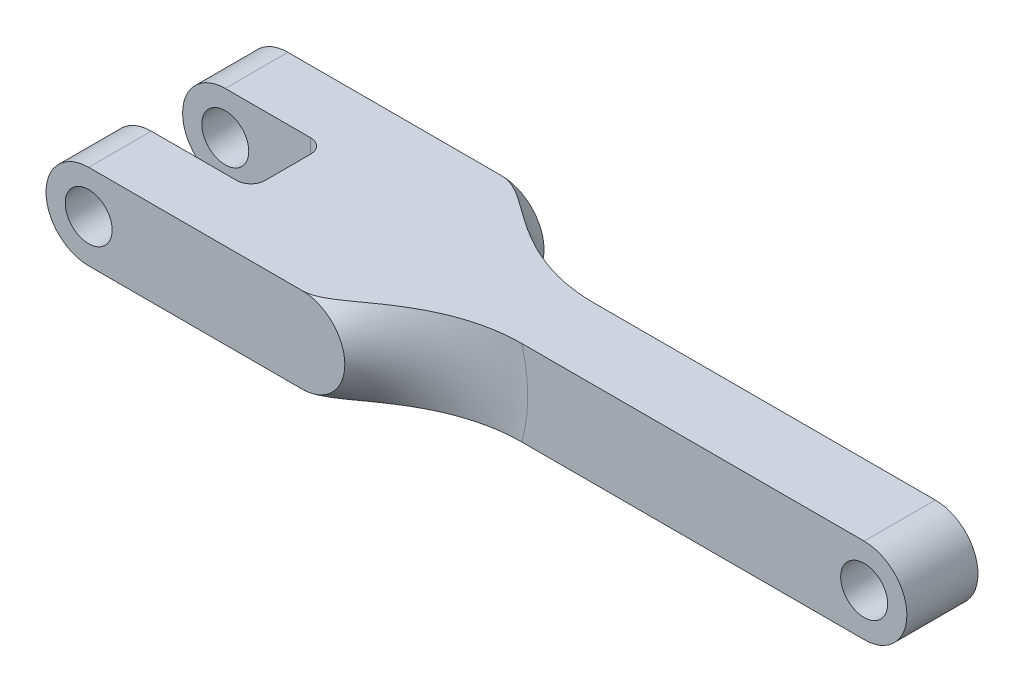
ISO-10303-21;
HEADER;
FILE_DESCRIPTION(('STEP AP214'),'2;1');
FILE_NAME('part.step','',(''),(''),'','','');
FILE_SCHEMA(('AUTOMOTIVE_DESIGN { 1 0 10303 214 1 1 1 1 }'));
ENDSEC;
DATA;
#1=APPLICATION_CONTEXT('core data for automotive mechanical design processes');
#2=APPLICATION_PROTOCOL_DEFINITION('international standard','automotive_design',2000,#1);
#3=PRODUCT_CONTEXT('',#1,'mechanical');
#4=PRODUCT('Part','Part','',(#3));
#5=PRODUCT_RELATED_PRODUCT_CATEGORY('part','',(#4));
#6=PRODUCT_DEFINITION_FORMATION('','',#4);
#7=PRODUCT_DEFINITION_CONTEXT('part definition',#1,'design');
#8=PRODUCT_DEFINITION('design','',#6,#7);
#9=PRODUCT_DEFINITION_SHAPE('','',#8);
#10=(LENGTH_UNIT() NAMED_UNIT(*) SI_UNIT(.MILLI.,.METRE.));
#11=(NAMED_UNIT(*) PLANE_ANGLE_UNIT() SI_UNIT($,.RADIAN.));
#12=(NAMED_UNIT(*) SI_UNIT($,.STERADIAN.) SOLID_ANGLE_UNIT());
#13=UNCERTAINTY_MEASURE_WITH_UNIT(LENGTH_MEASURE(1.E-05),#10,'distance_accuracy_value','');
#14=(GEOMETRIC_REPRESENTATION_CONTEXT(3) GLOBAL_UNCERTAINTY_ASSIGNED_CONTEXT((#13)) GLOBAL_UNIT_ASSIGNED_CONTEXT((#10,
#11,#12)) REPRESENTATION_CONTEXT('',''));
#15=CARTESIAN_POINT('',(0.,0.,0.));
#16=DIRECTION('',(0.,0.,1.));
#17=DIRECTION('',(1.,0.,0.));
#18=AXIS2_PLACEMENT_3D('',#15,#16,#17);
#19=CARTESIAN_POINT('',(-25.,0.,-2.5));
#20=DIRECTION('',(0.,0.,1.));
#21=DIRECTION('',(1.,0.,0.));
#22=AXIS2_PLACEMENT_3D('',#19,#20,#21);
#23=CYLINDRICAL_SURFACE('',#22,3.00000000000001);
#24=CARTESIAN_POINT('',(-25.,0.,2.6));
#25=DIRECTION('',(0.,0.,1.));
#26=DIRECTION('',(1.,0.,0.));
#27=AXIS2_PLACEMENT_3D('',#24,#25,#26);
#28=CIRCLE('',#27,3.00000000000001);
#29=CARTESIAN_POINT('',(-25.,-3.00000000000001,2.6));
#30=VERTEX_POINT('',#29);
#31=CARTESIAN_POINT('',(-25.,3.00000000000001,2.6));
#32=VERTEX_POINT('',#31);
#33=EDGE_CURVE('E501',#30,#32,#28,.F.);
#34=ORIENTED_EDGE('',*,*,#33,.F.);
#35=DIRECTION('',(0.,0.,1.));
#36=VECTOR('',#35,1.);
#37=CARTESIAN_POINT('',(-25.,-3.00000000000001,-2.5));
#38=LINE('',#37,#36);
#39=CARTESIAN_POINT('',(-25.,-3.00000000000001,7.));
#40=VERTEX_POINT('',#39);
#41=EDGE_CURVE('E181',#30,#40,#38,.T.);
#42=ORIENTED_EDGE('',*,*,#41,.T.);
#43=CARTESIAN_POINT('',(-25.,0.,7.));
#44=DIRECTION('',(0.,0.,1.));
#45=DIRECTION('',(1.,0.,0.));
#46=AXIS2_PLACEMENT_3D('',#43,#44,#45);
#47=CIRCLE('',#46,3.00000000000001);
#48=CARTESIAN_POINT('',(-25.,3.00000000000001,7.));
#49=VERTEX_POINT('',#48);
#50=EDGE_CURVE('E485',#49,#40,#47,.T.);
#51=ORIENTED_EDGE('',*,*,#50,.F.);
#52=DIRECTION('',(0.,0.,1.));
#53=VECTOR('',#52,1.);
#54=CARTESIAN_POINT('',(-25.,3.00000000000001,-2.5));
#55=LINE('',#54,#53);
#56=EDGE_CURVE('E166',#32,#49,#55,.T.);
#57=ORIENTED_EDGE('',*,*,#56,.F.);
#58=EDGE_LOOP('',(#34,#42,#51,#57));
#59=FACE_BOUND('',#58,.T.);
#60=ADVANCED_FACE('F38',(#59),#23,.T.);
#61=CARTESIAN_POINT('',(-25.,0.,-2.5));
#62=DIRECTION('',(0.,0.,1.));
#63=DIRECTION('',(1.,0.,0.));
#64=AXIS2_PLACEMENT_3D('',#61,#62,#63);
#65=CYLINDRICAL_SURFACE('',#64,1.65);
#66=CARTESIAN_POINT('',(-25.,0.,2.6));
#67=DIRECTION('',(0.,0.,1.));
#68=DIRECTION('',(1.,0.,0.));
#69=AXIS2_PLACEMENT_3D('',#66,#67,#68);
#70=CIRCLE('',#69,1.65);
#71=CARTESIAN_POINT('',(-23.35,0.,2.6));
#72=VERTEX_POINT('',#71);
#73=EDGE_CURVE('E158',#72,#72,#70,.F.);
#74=ORIENTED_EDGE('',*,*,#73,.T.);
#75=EDGE_LOOP('',(#74));
#76=FACE_BOUND('',#75,.T.);
#77=CARTESIAN_POINT('',(-25.,0.,7.));
#78=DIRECTION('',(0.,0.,1.));
#79=DIRECTION('',(1.,0.,0.));
#80=AXIS2_PLACEMENT_3D('',#77,#78,#79);
#81=CIRCLE('',#80,1.65);
#82=CARTESIAN_POINT('',(-23.35,0.,7.));
#83=VERTEX_POINT('',#82);
#84=EDGE_CURVE('E488',#83,#83,#81,.F.);
#85=ORIENTED_EDGE('',*,*,#84,.F.);
#86=EDGE_LOOP('',(#85));
#87=FACE_BOUND('',#86,.T.);
#88=ADVANCED_FACE('F245',(#76,#87),#65,.F.);
#89=CARTESIAN_POINT('',(-25.,0.,-2.6));
#90=DIRECTION('',(0.,0.,-1.));
#91=DIRECTION('',(-1.,0.,0.));
#92=AXIS2_PLACEMENT_3D('',#89,#90,#91);
#93=CIRCLE('',#92,3.00000000000001);
#94=CARTESIAN_POINT('',(-25.,3.00000000000001,-2.6));
#95=VERTEX_POINT('',#94);
#96=CARTESIAN_POINT('',(-25.,-3.00000000000001,-2.6));
#97=VERTEX_POINT('',#96);
#98=EDGE_CURVE('E143',#95,#97,#93,.F.);
#99=ORIENTED_EDGE('',*,*,#98,.F.);
#100=CARTESIAN_POINT('',(-25.,3.00000000000001,-7.));
#101=VERTEX_POINT('',#100);
#102=EDGE_CURVE('E155',#101,#95,#55,.T.);
#103=ORIENTED_EDGE('',*,*,#102,.F.);
#104=CARTESIAN_POINT('',(-25.,0.,-7.));
#105=DIRECTION('',(0.,0.,1.));
#106=DIRECTION('',(1.,0.,0.));
#107=AXIS2_PLACEMENT_3D('',#104,#105,#106);
#108=CIRCLE('',#107,3.00000000000001);
#109=CARTESIAN_POINT('',(-25.,-3.00000000000001,-7.));
#110=VERTEX_POINT('',#109);
#111=EDGE_CURVE('E480',#101,#110,#108,.T.);
#112=ORIENTED_EDGE('',*,*,#111,.T.);
#113=EDGE_CURVE('E157',#110,#97,#38,.T.);
#114=ORIENTED_EDGE('',*,*,#113,.T.);
#115=EDGE_LOOP('',(#99,#103,#112,#114));
#116=FACE_BOUND('',#115,.T.);
#117=ADVANCED_FACE('F153',(#116),#23,.T.);
#118=CARTESIAN_POINT('',(-25.,3.00000000000001,-2.5));
#119=DIRECTION('',(0.,1.,0.));
#120=DIRECTION('',(-1.,0.,0.));
#121=AXIS2_PLACEMENT_3D('',#118,#119,#120);
#122=PLANE('',#121);
#123=DIRECTION('',(1.,0.,0.));
#124=VECTOR('',#123,1.);
#125=CARTESIAN_POINT('',(-38.,3.00000000000001,2.6));
#126=LINE('',#125,#124);
#127=CARTESIAN_POINT('',(-19.,3.00000000000001,2.6));
#128=VERTEX_POINT('',#127);
#129=EDGE_CURVE('E148',#32,#128,#126,.T.);
#130=ORIENTED_EDGE('',*,*,#129,.F.);
#131=ORIENTED_EDGE('',*,*,#56,.T.);
#132=DIRECTION('',(-1.,0.,0.));
#133=VECTOR('',#132,1.);
#134=CARTESIAN_POINT('',(-10.,3.00000000000001,7.));
#135=LINE('',#134,#133);
#136=CARTESIAN_POINT('',(-10.,3.00000000000001,7.));
#137=VERTEX_POINT('',#136);
#138=EDGE_CURVE('E492',#137,#49,#135,.T.);
#139=ORIENTED_EDGE('',*,*,#138,.F.);
#140=CARTESIAN_POINT('',(-10.,3.00000000000001,7.));
#141=CARTESIAN_POINT('',(-9.93100894392409,3.00000000000001,7.00008008303738));
#142=CARTESIAN_POINT('',(-9.8620742356141,3.00000000000001,6.99638799243442));
#143=CARTESIAN_POINT('',(-9.72511944606995,3.00000000000001,6.98210412632536));
#144=CARTESIAN_POINT('',(-9.65709726805867,3.00000000000001,6.97153271701702));
#145=CARTESIAN_POINT('',(-9.52408836759168,3.00000000000001,6.94448034139262));
#146=CARTESIAN_POINT('',(-9.45906856989605,3.00000000000001,6.92815834472196));
#147=CARTESIAN_POINT('',(-9.33051215764935,3.00000000000001,6.89045438370021));
#148=CARTESIAN_POINT('',(-9.2669760765419,3.00000000000001,6.8690706293447));
#149=CARTESIAN_POINT('',(-9.10467960010152,3.00000000000001,6.80837946454936));
#150=CARTESIAN_POINT('',(-9.00710709270451,3.00000000000001,6.76591394373395));
#151=CARTESIAN_POINT('',(-8.81546580662071,3.00000000000001,6.67362769353524));
#152=CARTESIAN_POINT('',(-8.7214014449534,3.00000000000001,6.62379805934531));
#153=CARTESIAN_POINT('',(-8.53573255785194,3.00000000000001,6.51895037070297));
#154=CARTESIAN_POINT('',(-8.44413982089198,3.00000000000001,6.46391170127203));
#155=CARTESIAN_POINT('',(-8.26309272456588,3.00000000000001,6.35054709975563));
#156=CARTESIAN_POINT('',(-8.17363744957372,3.00000000000001,6.2922226125213));
#157=CARTESIAN_POINT('',(-7.99344572250771,3.00000000000001,6.17166636457782));
#158=CARTESIAN_POINT('',(-7.90275300364964,3.00000000000001,6.10936972304388));
#159=CARTESIAN_POINT('',(-7.72225713153496,3.00000000000001,5.98349452632061));
#160=CARTESIAN_POINT('',(-7.63245404784381,3.00000000000001,5.91991587204534));
#161=CARTESIAN_POINT('',(-7.45346867489873,3.00000000000001,5.79233770703959));
#162=CARTESIAN_POINT('',(-7.36428542031109,3.00000000000001,5.7283395451998));
#163=CARTESIAN_POINT('',(-7.18594586728653,3.00000000000001,5.60030479605617));
#164=CARTESIAN_POINT('',(-7.09678956912648,3.00000000000001,5.53626820837655));
#165=CARTESIAN_POINT('',(-6.83177244136055,3.00000000000001,5.34681085434581));
#166=CARTESIAN_POINT('',(-6.65550109026512,3.00000000000001,5.22195790075911));
#167=CARTESIAN_POINT('',(-6.30022520047109,3.00000000000001,4.97618022772545));
#168=CARTESIAN_POINT('',(-6.12122072447704,3.00000000000001,4.85525541835576));
#169=CARTESIAN_POINT('',(-5.75940981089372,3.00000000000001,4.61896447732696));
#170=CARTESIAN_POINT('',(-5.57660120454586,3.00000000000001,4.50360164819403));
#171=CARTESIAN_POINT('',(-5.20675854879743,3.00000000000001,4.27986503527652));
#172=CARTESIAN_POINT('',(-5.01972485233953,3.00000000000001,4.17149067060485));
#173=CARTESIAN_POINT('',(-4.64445230264709,3.00000000000001,3.96462037827449));
#174=CARTESIAN_POINT('',(-4.45628981167577,3.00000000000001,3.86598636061763));
#175=CARTESIAN_POINT('',(-4.07564374106825,3.00000000000001,3.67740647239178));
#176=CARTESIAN_POINT('',(-3.8831600620991,3.00000000000001,3.58746080179801));
#177=CARTESIAN_POINT('',(-3.49408473056017,3.00000000000001,3.41704780545013));
#178=CARTESIAN_POINT('',(-3.29749408286051,3.00000000000001,3.33657819239919));
#179=CARTESIAN_POINT('',(-2.90046795532155,3.00000000000001,3.1857615789657));
#180=CARTESIAN_POINT('',(-2.7000324507447,3.00000000000001,3.11541464373659));
#181=CARTESIAN_POINT('',(-2.22261867020565,3.00000000000001,2.9619316649099));
#182=CARTESIAN_POINT('',(-1.94415391546043,3.00000000000001,2.88336009150625));
#183=CARTESIAN_POINT('',(-1.38221942921181,3.00000000000001,2.74733421444282));
#184=CARTESIAN_POINT('',(-1.09875142039314,3.00000000000001,2.68987278540898));
#185=CARTESIAN_POINT('',(-0.522523587431851,3.00000000000001,2.59608764577041));
#186=CARTESIAN_POINT('',(-0.229690871521286,3.00000000000001,2.56020444701792));
#187=CARTESIAN_POINT('',(0.211064952194247,3.00000000000001,2.52416851042182));
#188=CARTESIAN_POINT('',(0.358307353839149,3.00000000000001,2.51512127538154));
#189=CARTESIAN_POINT('',(0.653044874901626,3.00000000000001,2.50303660189696));
#190=CARTESIAN_POINT('',(0.800540005469268,3.00000000000001,2.49999943581809));
#191=CARTESIAN_POINT('',(0.948053674762027,3.00000000000001,2.5));
#192=B_SPLINE_CURVE_WITH_KNOTS('',3,(#140,#141,#142,#143,#144,#145,#146,#147,#148,#149,#150,
#151,#152,#153,#154,#155,#156,#157,#158,#159,#160,#161,#162,#163,#164,#165,#166,#167,#168,#169,
#170,#171,#172,#173,#174,#175,#176,#177,#178,#179,#180,#181,#182,#183,#184,#185,#186,#187,#188,
#189,#190,#191),.UNSPECIFIED.,.F.,.F.,(4,2,2,2,2,2,2,2,2,2,2,2,2,2,2,2,2,2,2,2,2,2,2,2,2,4),(0.,
0.206784583887045,0.412959750862782,0.613832646617777,0.814776684055291,1.13353176647855,
1.45267549528105,1.77313974263923,2.09346415785949,2.42352720663273,2.75361586429805,
3.08292479779782,3.41223700609772,4.06023858693027,4.70822532329686,5.35659219092219,
6.00490509608849,6.64204145488714,7.27919247483187,7.91618938493303,8.55319039480727,
9.42037751634845,10.2872716639554,11.1713102409119,11.6137642457122,12.0562383012674),.UNSPECIFIED.);
#193=CARTESIAN_POINT('',(0.948053674762028,3.00000000000001,2.5));
#194=VERTEX_POINT('',#193);
#195=EDGE_CURVE('E219',#137,#194,#192,.T.);
#196=ORIENTED_EDGE('',*,*,#195,.T.);
#197=DIRECTION('',(-1.,0.,0.));
#198=VECTOR('',#197,1.);
#199=CARTESIAN_POINT('',(-25.,3.00000000000001,2.5));
#200=LINE('',#199,#198);
#201=CARTESIAN_POINT('',(25.,3.00000000000002,2.5));
#202=VERTEX_POINT('',#201);
#203=EDGE_CURVE('E467',#202,#194,#200,.T.);
#204=ORIENTED_EDGE('',*,*,#203,.F.);
#205=DIRECTION('',(0.,0.,1.));
#206=VECTOR('',#205,1.);
#207=CARTESIAN_POINT('',(25.,3.00000000000002,-2.5));
#208=LINE('',#207,#206);
#209=CARTESIAN_POINT('',(25.,3.00000000000002,-2.5));
#210=VERTEX_POINT('',#209);
#211=EDGE_CURVE('E171',#210,#202,#208,.T.);
#212=ORIENTED_EDGE('',*,*,#211,.F.);
#213=DIRECTION('',(-1.,0.,0.));
#214=VECTOR('',#213,1.);
#215=CARTESIAN_POINT('',(-25.,3.00000000000001,-2.5));
#216=LINE('',#215,#214);
#217=CARTESIAN_POINT('',(0.948053674762028,3.00000000000001,-2.5));
#218=VERTEX_POINT('',#217);
#219=EDGE_CURVE('E174',#210,#218,#216,.T.);
#220=ORIENTED_EDGE('',*,*,#219,.T.);
#221=CARTESIAN_POINT('',(0.948053674762027,3.00000000000001,-2.5));
#222=CARTESIAN_POINT('',(0.790014894792407,3.00000000000001,-2.49999925201318));
#223=CARTESIAN_POINT('',(0.631998988735049,3.00000000000001,-2.50348547223811));
#224=CARTESIAN_POINT('',(0.31627960489179,3.00000000000001,-2.51735046433023));
#225=CARTESIAN_POINT('',(0.158576107533132,3.00000000000001,-2.52772878975981));
#226=CARTESIAN_POINT('',(-0.313335468702413,3.00000000000001,-2.56904893357157));
#227=CARTESIAN_POINT('',(-0.626708252900214,3.00000000000001,-2.61017630790034));
#228=CARTESIAN_POINT('',(-1.24356000654493,3.00000000000001,-2.71768302628782));
#229=CARTESIAN_POINT('',(-1.54711668414514,3.00000000000001,-2.7836240603402));
#230=CARTESIAN_POINT('',(-2.14811135001017,3.00000000000001,-2.9395639738878));
#231=CARTESIAN_POINT('',(-2.4455470991117,3.00000000000001,-3.02957149465166));
#232=CARTESIAN_POINT('',(-2.93529500964177,3.00000000000001,-3.19842930531934));
#233=CARTESIAN_POINT('',(-3.12977495803585,3.00000000000001,-3.2710898292396));
#234=CARTESIAN_POINT('',(-3.51494172129722,3.00000000000001,-3.42584964477791));
#235=CARTESIAN_POINT('',(-3.70562862762268,3.00000000000001,-3.50794870848868));
#236=CARTESIAN_POINT('',(-4.08296264317381,3.00000000000001,-3.68092853307198));
#237=CARTESIAN_POINT('',(-4.26960976906944,3.00000000000001,-3.77180925769893));
#238=CARTESIAN_POINT('',(-4.6387611715932,3.00000000000001,-3.96160024333752));
#239=CARTESIAN_POINT('',(-4.82126551992543,3.00000000000001,-4.06051036523877));
#240=CARTESIAN_POINT('',(-5.18304941681586,3.00000000000001,-4.26597749832027));
#241=CARTESIAN_POINT('',(-5.3623095695595,3.00000000000001,-4.37256854679013));
#242=CARTESIAN_POINT('',(-5.71700068425621,3.00000000000001,-4.59194572186083));
#243=CARTESIAN_POINT('',(-5.89243135099867,3.00000000000001,-4.70473232372942));
#244=CARTESIAN_POINT('',(-6.24002984014728,3.00000000000001,-4.93522264346991));
#245=CARTESIAN_POINT('',(-6.41219745499625,3.00000000000001,-5.05292667261525));
#246=CARTESIAN_POINT('',(-6.75423173241715,3.00000000000001,-5.2916158600072));
#247=CARTESIAN_POINT('',(-6.92409833304931,3.00000000000001,-5.41260110631699));
#248=CARTESIAN_POINT('',(-7.21747344569643,3.00000000000001,-5.62284342152302));
#249=CARTESIAN_POINT('',(-7.34114812629459,3.00000000000001,-5.71187154044826));
#250=CARTESIAN_POINT('',(-7.589055305683,3.00000000000001,-5.88918753267295));
#251=CARTESIAN_POINT('',(-7.71328786711541,3.00000000000001,-5.97747531948185));
#252=CARTESIAN_POINT('',(-7.96361031443297,3.00000000000001,-6.15152027521048));
#253=CARTESIAN_POINT('',(-8.08970101369618,3.00000000000001,-6.23727628337735));
#254=CARTESIAN_POINT('',(-8.34535553946453,3.00000000000001,-6.40343688402356));
#255=CARTESIAN_POINT('',(-8.47491750411487,3.00000000000001,-6.48384426777211));
#256=CARTESIAN_POINT('',(-8.67734011808544,3.00000000000001,-6.59923084873896));
#257=CARTESIAN_POINT('',(-8.74814774465851,3.00000000000001,-6.63776109278631));
#258=CARTESIAN_POINT('',(-8.8916684039877,3.00000000000001,-6.7110705347437));
#259=CARTESIAN_POINT('',(-8.96438182408171,3.00000000000001,-6.74584896266165));
#260=CARTESIAN_POINT('',(-9.18489647837346,3.00000000000001,-6.84231748682175));
#261=CARTESIAN_POINT('',(-9.33617389967174,3.00000000000001,-6.89681117975637));
#262=CARTESIAN_POINT('',(-9.57412390970428,3.00000000000001,-6.95618383585763));
#263=CARTESIAN_POINT('',(-9.65794393849508,3.00000000000001,-6.97234787466968));
#264=CARTESIAN_POINT('',(-9.78510660642607,3.00000000000001,-6.9887982522684));
#265=CARTESIAN_POINT('',(-9.82795762253231,3.00000000000001,-6.99298348761102));
#266=CARTESIAN_POINT('',(-9.91386865899888,3.00000000000001,-6.99859068006285));
#267=CARTESIAN_POINT('',(-9.95692880238104,3.00000000000001,-7.0000107430869));
#268=CARTESIAN_POINT('',(-10.,3.00000000000001,-7.));
#269=B_SPLINE_CURVE_WITH_KNOTS('',3,(#221,#222,#223,#224,#225,#226,#227,#228,#229,#230,#231,
#232,#233,#234,#235,#236,#237,#238,#239,#240,#241,#242,#243,#244,#245,#246,#247,#248,#249,#250,
#251,#252,#253,#254,#255,#256,#257,#258,#259,#260,#261,#262,#263,#264,#265,#266,#267,#268),
.UNSPECIFIED.,.F.,.F.,(4,2,2,2,2,2,2,2,2,2,2,2,2,2,2,2,2,2,2,2,2,2,2,4),(0.,0.474033988275218,
0.948037273890537,1.89495669455418,2.82588009615007,3.75713820330364,4.37973686390646,
5.00232049411494,5.62490155477042,6.2474718314264,6.87299432607458,7.49856487243787,
8.12417507763014,8.74980208995365,9.20696277805541,9.6641761507595,10.1215959870435,
10.5787752073497,10.8205028362092,11.0622799812682,11.5419836695372,11.7974715075319,
11.9265534331802,12.0557237461855),.UNSPECIFIED.);
#270=CARTESIAN_POINT('',(-10.,3.00000000000001,-7.));
#271=VERTEX_POINT('',#270);
#272=EDGE_CURVE('E192',#218,#271,#269,.T.);
#273=ORIENTED_EDGE('',*,*,#272,.T.);
#274=DIRECTION('',(1.,0.,0.));
#275=VECTOR('',#274,1.);
#276=CARTESIAN_POINT('',(-10.,3.00000000000001,-7.));
#277=LINE('',#276,#275);
#278=EDGE_CURVE('E164',#101,#271,#277,.T.);
#279=ORIENTED_EDGE('',*,*,#278,.F.);
#280=ORIENTED_EDGE('',*,*,#102,.T.);
#281=DIRECTION('',(-1.,0.,0.));
#282=VECTOR('',#281,1.);
#283=CARTESIAN_POINT('',(-38.,3.00000000000001,-2.6));
#284=LINE('',#283,#282);
#285=CARTESIAN_POINT('',(-19.,3.00000000000001,-2.6));
#286=VERTEX_POINT('',#285);
#287=EDGE_CURVE('E138',#286,#95,#284,.T.);
#288=ORIENTED_EDGE('',*,*,#287,.F.);
#289=CARTESIAN_POINT('',(-19.,3.00000000000001,-1.6));
#290=DIRECTION('',(0.,1.,0.));
#291=DIRECTION('',(-1.,0.,0.));
#292=AXIS2_PLACEMENT_3D('',#289,#290,#291);
#293=CIRCLE('',#292,1.);
#294=CARTESIAN_POINT('',(-18.,3.00000000000001,-1.6));
#295=VERTEX_POINT('',#294);
#296=EDGE_CURVE('E515',#286,#295,#293,.F.);
#297=ORIENTED_EDGE('',*,*,#296,.T.);
#298=DIRECTION('',(0.,0.,-1.));
#299=VECTOR('',#298,1.);
#300=CARTESIAN_POINT('',(-18.,3.00000000000001,-2.6));
#301=LINE('',#300,#299);
#302=CARTESIAN_POINT('',(-18.,3.00000000000001,1.6));
#303=VERTEX_POINT('',#302);
#304=EDGE_CURVE('E149',#303,#295,#301,.T.);
#305=ORIENTED_EDGE('',*,*,#304,.F.);
#306=CARTESIAN_POINT('',(-19.,3.00000000000001,1.6));
#307=DIRECTION('',(0.,1.,0.));
#308=DIRECTION('',(-1.,0.,0.));
#309=AXIS2_PLACEMENT_3D('',#306,#307,#308);
#310=CIRCLE('',#309,1.);
#311=EDGE_CURVE('E46',#303,#128,#310,.F.);
#312=ORIENTED_EDGE('',*,*,#311,.T.);
#313=EDGE_LOOP('',(#130,#131,#139,#196,#204,#212,#220,#273,#279,#280,#288,#297,#305,#312));
#314=FACE_BOUND('',#313,.T.);
#315=ADVANCED_FACE('F162',(#314),#122,.T.);
#316=CARTESIAN_POINT('',(25.,0.,-2.5));
#317=DIRECTION('',(0.,0.,1.));
#318=DIRECTION('',(1.,0.,0.));
#319=AXIS2_PLACEMENT_3D('',#316,#317,#318);
#320=CYLINDRICAL_SURFACE('',#319,3.00000000000001);
#321=ORIENTED_EDGE('',*,*,#211,.T.);
#322=CARTESIAN_POINT('',(25.,0.,2.5));
#323=DIRECTION('',(0.,0.,1.));
#324=DIRECTION('',(1.,0.,0.));
#325=AXIS2_PLACEMENT_3D('',#322,#323,#324);
#326=CIRCLE('',#325,3.00000000000001);
#327=CARTESIAN_POINT('',(25.,-3.00000000000001,2.5));
#328=VERTEX_POINT('',#327);
#329=EDGE_CURVE('E472',#328,#202,#326,.T.);
#330=ORIENTED_EDGE('',*,*,#329,.F.);
#331=DIRECTION('',(0.,0.,1.));
#332=VECTOR('',#331,1.);
#333=CARTESIAN_POINT('',(25.,-3.00000000000001,-2.5));
#334=LINE('',#333,#332);
#335=CARTESIAN_POINT('',(25.,-3.00000000000001,-2.5));
#336=VERTEX_POINT('',#335);
#337=EDGE_CURVE('E177',#336,#328,#334,.T.);
#338=ORIENTED_EDGE('',*,*,#337,.F.);
#339=CARTESIAN_POINT('',(25.,0.,-2.5));
#340=DIRECTION('',(0.,0.,1.));
#341=DIRECTION('',(1.,0.,0.));
#342=AXIS2_PLACEMENT_3D('',#339,#340,#341);
#343=CIRCLE('',#342,3.00000000000001);
#344=EDGE_CURVE('E463',#336,#210,#343,.T.);
#345=ORIENTED_EDGE('',*,*,#344,.T.);
#346=EDGE_LOOP('',(#321,#330,#338,#345));
#347=FACE_BOUND('',#346,.T.);
#348=ADVANCED_FACE('F215',(#347),#320,.T.);
#349=CARTESIAN_POINT('',(-25.,-3.00000000000001,-2.5));
#350=DIRECTION('',(0.,-1.,0.));
#351=DIRECTION('',(1.,0.,0.));
#352=AXIS2_PLACEMENT_3D('',#349,#350,#351);
#353=PLANE('',#352);
#354=DIRECTION('',(-1.,0.,0.));
#355=VECTOR('',#354,1.);
#356=CARTESIAN_POINT('',(-25.,-3.00000000000001,2.6));
#357=LINE('',#356,#355);
#358=CARTESIAN_POINT('',(-19.,-3.00000000000001,2.6));
#359=VERTEX_POINT('',#358);
#360=EDGE_CURVE('E186',#359,#30,#357,.T.);
#361=ORIENTED_EDGE('',*,*,#360,.F.);
#362=CARTESIAN_POINT('',(-19.,-3.00000000000001,1.6));
#363=DIRECTION('',(0.,-1.,0.));
#364=DIRECTION('',(1.,0.,0.));
#365=AXIS2_PLACEMENT_3D('',#362,#363,#364);
#366=CIRCLE('',#365,1.);
#367=CARTESIAN_POINT('',(-18.,-3.00000000000001,1.6));
#368=VERTEX_POINT('',#367);
#369=EDGE_CURVE('E11',#359,#368,#366,.F.);
#370=ORIENTED_EDGE('',*,*,#369,.T.);
#371=DIRECTION('',(0.,0.,1.));
#372=VECTOR('',#371,1.);
#373=CARTESIAN_POINT('',(-18.,-3.00000000000001,-2.5));
#374=LINE('',#373,#372);
#375=CARTESIAN_POINT('',(-18.,-3.00000000000001,-1.6));
#376=VERTEX_POINT('',#375);
#377=EDGE_CURVE('E165',#376,#368,#374,.T.);
#378=ORIENTED_EDGE('',*,*,#377,.F.);
#379=CARTESIAN_POINT('',(-19.,-3.00000000000001,-1.6));
#380=DIRECTION('',(0.,-1.,0.));
#381=DIRECTION('',(1.,0.,0.));
#382=AXIS2_PLACEMENT_3D('',#379,#380,#381);
#383=CIRCLE('',#382,1.);
#384=CARTESIAN_POINT('',(-19.,-3.00000000000001,-2.6));
#385=VERTEX_POINT('',#384);
#386=EDGE_CURVE('E516',#376,#385,#383,.F.);
#387=ORIENTED_EDGE('',*,*,#386,.T.);
#388=DIRECTION('',(1.,0.,0.));
#389=VECTOR('',#388,1.);
#390=CARTESIAN_POINT('',(-25.,-3.00000000000001,-2.6));
#391=LINE('',#390,#389);
#392=EDGE_CURVE('E159',#97,#385,#391,.T.);
#393=ORIENTED_EDGE('',*,*,#392,.F.);
#394=ORIENTED_EDGE('',*,*,#113,.F.);
#395=DIRECTION('',(-1.,0.,0.));
#396=VECTOR('',#395,1.);
#397=CARTESIAN_POINT('',(-25.,-3.00000000000001,-7.));
#398=LINE('',#397,#396);
#399=CARTESIAN_POINT('',(-10.,-3.00000000000001,-7.));
#400=VERTEX_POINT('',#399);
#401=EDGE_CURVE('E457',#400,#110,#398,.T.);
#402=ORIENTED_EDGE('',*,*,#401,.F.);
#403=CARTESIAN_POINT('',(-10.,-3.00000000000001,-7.));
#404=CARTESIAN_POINT('',(-9.93100894392409,-3.00000000000001,-7.00008008303738));
#405=CARTESIAN_POINT('',(-9.8620742356141,-3.00000000000001,-6.99638799243442));
#406=CARTESIAN_POINT('',(-9.72511944606995,-3.00000000000001,-6.98210412632536));
#407=CARTESIAN_POINT('',(-9.65709726805867,-3.00000000000001,-6.97153271701702));
#408=CARTESIAN_POINT('',(-9.52408836759168,-3.00000000000001,-6.94448034139262));
#409=CARTESIAN_POINT('',(-9.45906856989605,-3.00000000000001,-6.92815834472196));
#410=CARTESIAN_POINT('',(-9.33051215764935,-3.00000000000001,-6.89045438370021));
#411=CARTESIAN_POINT('',(-9.2669760765419,-3.00000000000001,-6.86907062934471));
#412=CARTESIAN_POINT('',(-9.10467960010152,-3.00000000000001,-6.80837946454936));
#413=CARTESIAN_POINT('',(-9.00710709270451,-3.00000000000001,-6.76591394373396));
#414=CARTESIAN_POINT('',(-8.81546580662072,-3.00000000000001,-6.67362769353525));
#415=CARTESIAN_POINT('',(-8.72140144495341,-3.00000000000001,-6.62379805934532));
#416=CARTESIAN_POINT('',(-8.53573255785195,-3.00000000000001,-6.51895037070298));
#417=CARTESIAN_POINT('',(-8.44413982089198,-3.00000000000001,-6.46391170127204));
#418=CARTESIAN_POINT('',(-8.26309272456589,-3.00000000000001,-6.35054709975563));
#419=CARTESIAN_POINT('',(-8.17363744957373,-3.00000000000001,-6.29222261252131));
#420=CARTESIAN_POINT('',(-7.99344572250772,-3.00000000000001,-6.17166636457783));
#421=CARTESIAN_POINT('',(-7.90275300364965,-3.00000000000001,-6.10936972304389));
#422=CARTESIAN_POINT('',(-7.72225713153497,-3.00000000000001,-5.98349452632062));
#423=CARTESIAN_POINT('',(-7.63245404784382,-3.00000000000001,-5.91991587204535));
#424=CARTESIAN_POINT('',(-7.45346867489874,-3.00000000000001,-5.7923377070396));
#425=CARTESIAN_POINT('',(-7.3642854203111,-3.00000000000001,-5.72833954519981));
#426=CARTESIAN_POINT('',(-7.18594586728654,-3.00000000000001,-5.60030479605619));
#427=CARTESIAN_POINT('',(-7.0967895691265,-3.00000000000001,-5.53626820837656));
#428=CARTESIAN_POINT('',(-6.83177244136056,-3.00000000000001,-5.34681085434583));
#429=CARTESIAN_POINT('',(-6.65550109026513,-3.00000000000001,-5.22195790075913));
#430=CARTESIAN_POINT('',(-6.30022520047111,-3.00000000000001,-4.97618022772547));
#431=CARTESIAN_POINT('',(-6.12122072447707,-3.00000000000001,-4.85525541835577));
#432=CARTESIAN_POINT('',(-5.75940981089375,-3.00000000000001,-4.61896447732698));
#433=CARTESIAN_POINT('',(-5.57660120454588,-3.00000000000001,-4.50360164819405));
#434=CARTESIAN_POINT('',(-5.20675854879746,-3.00000000000001,-4.27986503527655));
#435=CARTESIAN_POINT('',(-5.01972485233956,-3.00000000000001,-4.17149067060487));
#436=CARTESIAN_POINT('',(-4.64445230264713,-3.00000000000001,-3.96462037827451));
#437=CARTESIAN_POINT('',(-4.45628981167581,-3.00000000000001,-3.86598636061764));
#438=CARTESIAN_POINT('',(-4.07564374106829,-3.00000000000001,-3.67740647239181));
#439=CARTESIAN_POINT('',(-3.88316006209914,-3.00000000000001,-3.58746080179804));
#440=CARTESIAN_POINT('',(-3.49408473056022,-3.00000000000001,-3.41704780545015));
#441=CARTESIAN_POINT('',(-3.29749408286055,-3.00000000000001,-3.33657819239921));
#442=CARTESIAN_POINT('',(-2.9004679553216,-3.00000000000001,-3.18576157896572));
#443=CARTESIAN_POINT('',(-2.70003245074475,-3.00000000000001,-3.11541464373661));
#444=CARTESIAN_POINT('',(-2.2226186702057,-3.00000000000001,-2.96193166490992));
#445=CARTESIAN_POINT('',(-1.94415391546048,-3.,-2.88336009150626));
#446=CARTESIAN_POINT('',(-1.38221942921184,-3.,-2.74733421444283));
#447=CARTESIAN_POINT('',(-1.09875142039318,-3.,-2.68987278540899));
#448=CARTESIAN_POINT('',(-0.522523587431877,-3.,-2.59608764577042));
#449=CARTESIAN_POINT('',(-0.229690871521307,-3.,-2.56020444701793));
#450=CARTESIAN_POINT('',(0.211064952194234,-3.,-2.52416851042182));
#451=CARTESIAN_POINT('',(0.358307353839138,-3.,-2.51512127538154));
#452=CARTESIAN_POINT('',(0.653044874901621,-3.,-2.50303660189696));
#453=CARTESIAN_POINT('',(0.800540005469267,-3.,-2.49999943581809));
#454=CARTESIAN_POINT('',(0.948053674762028,-3.,-2.5));
#455=B_SPLINE_CURVE_WITH_KNOTS('',3,(#403,#404,#405,#406,#407,#408,#409,#410,#411,#412,#413,
#414,#415,#416,#417,#418,#419,#420,#421,#422,#423,#424,#425,#426,#427,#428,#429,#430,#431,#432,
#433,#434,#435,#436,#437,#438,#439,#440,#441,#442,#443,#444,#445,#446,#447,#448,#449,#450,#451,
#452,#453,#454),.UNSPECIFIED.,.F.,.F.,(4,2,2,2,2,2,2,2,2,2,2,2,2,2,2,2,2,2,2,2,2,2,2,2,2,4),(0.,
0.206784583887042,0.412959750862782,0.613832646617777,0.814776684055288,1.13353176647854,
1.45267549528104,1.77313974263922,2.09346415785947,2.42352720663271,2.75361586429803,
3.0829247977978,3.4122370060977,4.06023858693024,4.70822532329683,5.35659219092215,
6.00490509608845,6.6420414548871,7.27919247483182,7.91618938493297,8.55319039480721,
9.42037751634841,10.2872716639554,11.1713102409119,11.6137642457122,12.0562383012674),.UNSPECIFIED.);
#456=CARTESIAN_POINT('',(0.948053674762028,-3.,-2.5));
#457=VERTEX_POINT('',#456);
#458=EDGE_CURVE('E200',#400,#457,#455,.T.);
#459=ORIENTED_EDGE('',*,*,#458,.T.);
#460=DIRECTION('',(1.,0.,0.));
#461=VECTOR('',#460,1.);
#462=CARTESIAN_POINT('',(-25.,-3.00000000000001,-2.5));
#463=LINE('',#462,#461);
#464=EDGE_CURVE('E454',#457,#336,#463,.T.);
#465=ORIENTED_EDGE('',*,*,#464,.T.);
#466=ORIENTED_EDGE('',*,*,#337,.T.);
#467=DIRECTION('',(1.,0.,0.));
#468=VECTOR('',#467,1.);
#469=CARTESIAN_POINT('',(-25.,-3.00000000000001,2.5));
#470=LINE('',#469,#468);
#471=CARTESIAN_POINT('',(0.948053674762028,-3.,2.5));
#472=VERTEX_POINT('',#471);
#473=EDGE_CURVE('E475',#472,#328,#470,.T.);
#474=ORIENTED_EDGE('',*,*,#473,.F.);
#475=CARTESIAN_POINT('',(0.948053674762028,-3.,2.5));
#476=CARTESIAN_POINT('',(0.790014894792409,-3.,2.49999925201318));
#477=CARTESIAN_POINT('',(0.63199898873505,-3.,2.50348547223811));
#478=CARTESIAN_POINT('',(0.316279604891792,-3.,2.51735046433023));
#479=CARTESIAN_POINT('',(0.158576107533134,-3.,2.52772878975981));
#480=CARTESIAN_POINT('',(-0.313335468702411,-3.,2.56904893357157));
#481=CARTESIAN_POINT('',(-0.626708252900211,-3.,2.61017630790034));
#482=CARTESIAN_POINT('',(-1.24356000654493,-3.,2.71768302628782));
#483=CARTESIAN_POINT('',(-1.54711668414514,-3.,2.7836240603402));
#484=CARTESIAN_POINT('',(-2.14811135001017,-3.,2.9395639738878));
#485=CARTESIAN_POINT('',(-2.4455470991117,-3.00000000000001,3.02957149465166));
#486=CARTESIAN_POINT('',(-2.93529500964177,-3.00000000000001,3.19842930531934));
#487=CARTESIAN_POINT('',(-3.12977495803584,-3.00000000000001,3.27108982923961));
#488=CARTESIAN_POINT('',(-3.51494172129722,-3.00000000000001,3.42584964477791));
#489=CARTESIAN_POINT('',(-3.70562862762268,-3.00000000000001,3.50794870848868));
#490=CARTESIAN_POINT('',(-4.0829626431738,-3.00000000000001,3.68092853307198));
#491=CARTESIAN_POINT('',(-4.26960976906944,-3.00000000000001,3.77180925769893));
#492=CARTESIAN_POINT('',(-4.6387611715932,-3.00000000000001,3.96160024333752));
#493=CARTESIAN_POINT('',(-4.82126551992543,-3.00000000000001,4.06051036523877));
#494=CARTESIAN_POINT('',(-5.18304941681586,-3.00000000000001,4.26597749832027));
#495=CARTESIAN_POINT('',(-5.3623095695595,-3.00000000000001,4.37256854679013));
#496=CARTESIAN_POINT('',(-5.71700068425621,-3.00000000000001,4.59194572186083));
#497=CARTESIAN_POINT('',(-5.89243135099867,-3.00000000000001,4.70473232372942));
#498=CARTESIAN_POINT('',(-6.24002984014727,-3.00000000000001,4.93522264346992));
#499=CARTESIAN_POINT('',(-6.41219745499625,-3.00000000000001,5.05292667261525));
#500=CARTESIAN_POINT('',(-6.75423173241715,-3.00000000000001,5.2916158600072));
#501=CARTESIAN_POINT('',(-6.92409833304931,-3.00000000000001,5.41260110631699));
#502=CARTESIAN_POINT('',(-7.21747344569643,-3.00000000000001,5.62284342152303));
#503=CARTESIAN_POINT('',(-7.34114812629459,-3.00000000000001,5.71187154044826));
#504=CARTESIAN_POINT('',(-7.589055305683,-3.00000000000001,5.88918753267295));
#505=CARTESIAN_POINT('',(-7.71328786711541,-3.00000000000001,5.97747531948185));
#506=CARTESIAN_POINT('',(-7.96361031443297,-3.00000000000001,6.15152027521048));
#507=CARTESIAN_POINT('',(-8.08970101369618,-3.00000000000001,6.23727628337735));
#508=CARTESIAN_POINT('',(-8.34535553946453,-3.00000000000001,6.40343688402356));
#509=CARTESIAN_POINT('',(-8.47491750411487,-3.00000000000001,6.48384426777211));
#510=CARTESIAN_POINT('',(-8.67734011808544,-3.00000000000001,6.59923084873897));
#511=CARTESIAN_POINT('',(-8.74814774465851,-3.00000000000001,6.63776109278632));
#512=CARTESIAN_POINT('',(-8.89166840398771,-3.00000000000001,6.71107053474371));
#513=CARTESIAN_POINT('',(-8.96438182408171,-3.00000000000001,6.74584896266165));
#514=CARTESIAN_POINT('',(-9.18489647837346,-3.00000000000001,6.84231748682176));
#515=CARTESIAN_POINT('',(-9.33617389967174,-3.00000000000001,6.89681117975637));
#516=CARTESIAN_POINT('',(-9.57412390970428,-3.00000000000001,6.95618383585763));
#517=CARTESIAN_POINT('',(-9.65794393849507,-3.00000000000001,6.97234787466969));
#518=CARTESIAN_POINT('',(-9.78510660642607,-3.00000000000001,6.9887982522684));
#519=CARTESIAN_POINT('',(-9.82795762253231,-3.00000000000001,6.99298348761102));
#520=CARTESIAN_POINT('',(-9.91386865899888,-3.00000000000001,6.99859068006285));
#521=CARTESIAN_POINT('',(-9.95692880238104,-3.00000000000001,7.0000107430869));
#522=CARTESIAN_POINT('',(-10.,-3.00000000000001,7.));
#523=B_SPLINE_CURVE_WITH_KNOTS('',3,(#475,#476,#477,#478,#479,#480,#481,#482,#483,#484,#485,
#486,#487,#488,#489,#490,#491,#492,#493,#494,#495,#496,#497,#498,#499,#500,#501,#502,#503,#504,
#505,#506,#507,#508,#509,#510,#511,#512,#513,#514,#515,#516,#517,#518,#519,#520,#521,#522),
.UNSPECIFIED.,.F.,.F.,(4,2,2,2,2,2,2,2,2,2,2,2,2,2,2,2,2,2,2,2,2,2,2,4),(0.,0.474033988275218,
0.948037273890537,1.89495669455418,2.82588009615007,3.75713820330364,4.37973686390647,
5.00232049411494,5.62490155477042,6.2474718314264,6.87299432607459,7.49856487243787,
8.12417507763014,8.74980208995365,9.20696277805541,9.66417615075951,10.1215959870435,
10.5787752073497,10.8205028362092,11.0622799812682,11.5419836695372,11.7974715075319,
11.9265534331801,12.0557237461855),.UNSPECIFIED.);
#524=CARTESIAN_POINT('',(-10.,-3.00000000000001,7.));
#525=VERTEX_POINT('',#524);
#526=EDGE_CURVE('E225',#472,#525,#523,.T.);
#527=ORIENTED_EDGE('',*,*,#526,.T.);
#528=DIRECTION('',(1.,0.,0.));
#529=VECTOR('',#528,1.);
#530=CARTESIAN_POINT('',(-25.,-3.00000000000001,7.));
#531=LINE('',#530,#529);
#532=EDGE_CURVE('E498',#40,#525,#531,.T.);
#533=ORIENTED_EDGE('',*,*,#532,.F.);
#534=ORIENTED_EDGE('',*,*,#41,.F.);
#535=EDGE_LOOP('',(#361,#370,#378,#387,#393,#394,#402,#459,#465,#466,#474,#527,#533,#534));
#536=FACE_BOUND('',#535,.T.);
#537=ADVANCED_FACE('F271',(#536),#353,.T.);
#538=CARTESIAN_POINT('',(-25.,0.,-2.5));
#539=DIRECTION('',(0.,0.,1.));
#540=DIRECTION('',(1.,0.,0.));
#541=AXIS2_PLACEMENT_3D('',#538,#539,#540);
#542=PLANE('',#541);
#543=CARTESIAN_POINT('',(25.,0.,-2.5));
#544=DIRECTION('',(0.,0.,1.));
#545=DIRECTION('',(1.,0.,0.));
#546=AXIS2_PLACEMENT_3D('',#543,#544,#545);
#547=CIRCLE('',#546,1.65);
#548=CARTESIAN_POINT('',(26.65,0.,-2.5));
#549=VERTEX_POINT('',#548);
#550=EDGE_CURVE('E464',#549,#549,#547,.T.);
#551=ORIENTED_EDGE('',*,*,#550,.T.);
#552=EDGE_LOOP('',(#551));
#553=FACE_BOUND('',#552,.T.);
#554=ORIENTED_EDGE('',*,*,#464,.F.);
#555=CARTESIAN_POINT('',(-10.,0.,-2.5));
#556=DIRECTION('',(0.,0.,1.));
#557=DIRECTION('',(1.,0.,0.));
#558=AXIS2_PLACEMENT_3D('',#555,#556,#557);
#559=CIRCLE('',#558,11.351646544245);
#560=EDGE_CURVE('E169',#457,#218,#559,.T.);
#561=ORIENTED_EDGE('',*,*,#560,.T.);
#562=ORIENTED_EDGE('',*,*,#219,.F.);
#563=ORIENTED_EDGE('',*,*,#344,.F.);
#564=EDGE_LOOP('',(#554,#561,#562,#563));
#565=FACE_BOUND('',#564,.T.);
#566=ADVANCED_FACE('F216',(#553,#565),#542,.F.);
#567=CARTESIAN_POINT('',(25.,0.,-2.5));
#568=DIRECTION('',(0.,0.,1.));
#569=DIRECTION('',(1.,0.,0.));
#570=AXIS2_PLACEMENT_3D('',#567,#568,#569);
#571=CYLINDRICAL_SURFACE('',#570,1.65);
#572=ORIENTED_EDGE('',*,*,#550,.F.);
#573=EDGE_LOOP('',(#572));
#574=FACE_BOUND('',#573,.T.);
#575=CARTESIAN_POINT('',(25.,0.,2.5));
#576=DIRECTION('',(0.,0.,1.));
#577=DIRECTION('',(1.,0.,0.));
#578=AXIS2_PLACEMENT_3D('',#575,#576,#577);
#579=CIRCLE('',#578,1.65);
#580=CARTESIAN_POINT('',(26.65,0.,2.5));
#581=VERTEX_POINT('',#580);
#582=EDGE_CURVE('E477',#581,#581,#579,.T.);
#583=ORIENTED_EDGE('',*,*,#582,.T.);
#584=EDGE_LOOP('',(#583));
#585=FACE_BOUND('',#584,.T.);
#586=ADVANCED_FACE('F285',(#574,#585),#571,.F.);
#587=CARTESIAN_POINT('',(-25.,0.,2.5));
#588=DIRECTION('',(0.,0.,1.));
#589=DIRECTION('',(1.,0.,0.));
#590=AXIS2_PLACEMENT_3D('',#587,#588,#589);
#591=PLANE('',#590);
#592=ORIENTED_EDGE('',*,*,#203,.T.);
#593=CARTESIAN_POINT('',(-10.,0.,2.5));
#594=DIRECTION('',(0.,0.,1.));
#595=DIRECTION('',(1.,0.,0.));
#596=AXIS2_PLACEMENT_3D('',#593,#594,#595);
#597=CIRCLE('',#596,11.351646544245);
#598=EDGE_CURVE('E190',#194,#472,#597,.F.);
#599=ORIENTED_EDGE('',*,*,#598,.T.);
#600=ORIENTED_EDGE('',*,*,#473,.T.);
#601=ORIENTED_EDGE('',*,*,#329,.T.);
#602=EDGE_LOOP('',(#592,#599,#600,#601));
#603=FACE_BOUND('',#602,.T.);
#604=ORIENTED_EDGE('',*,*,#582,.F.);
#605=EDGE_LOOP('',(#604));
#606=FACE_BOUND('',#605,.T.);
#607=ADVANCED_FACE('F292',(#603,#606),#591,.T.);
#608=CARTESIAN_POINT('',(0.,0.,7.));
#609=DIRECTION('',(0.,0.,1.));
#610=DIRECTION('',(1.,0.,0.));
#611=AXIS2_PLACEMENT_3D('',#608,#609,#610);
#612=PLANE('',#611);
#613=ORIENTED_EDGE('',*,*,#84,.T.);
#614=EDGE_LOOP('',(#613));
#615=FACE_BOUND('',#614,.T.);
#616=ORIENTED_EDGE('',*,*,#50,.T.);
#617=ORIENTED_EDGE('',*,*,#532,.T.);
#618=CARTESIAN_POINT('',(-10.,0.,7.));
#619=DIRECTION('',(0.,0.,1.));
#620=DIRECTION('',(1.,0.,0.));
#621=AXIS2_PLACEMENT_3D('',#618,#619,#620);
#622=CIRCLE('',#621,3.00000000000001);
#623=EDGE_CURVE('E495',#525,#137,#622,.T.);
#624=ORIENTED_EDGE('',*,*,#623,.T.);
#625=ORIENTED_EDGE('',*,*,#138,.T.);
#626=EDGE_LOOP('',(#616,#617,#624,#625));
#627=FACE_BOUND('',#626,.T.);
#628=ADVANCED_FACE('F299',(#615,#627),#612,.T.);
#629=CARTESIAN_POINT('',(-25.,0.,-2.6));
#630=DIRECTION('',(0.,0.,-1.));
#631=DIRECTION('',(-1.,0.,0.));
#632=AXIS2_PLACEMENT_3D('',#629,#630,#631);
#633=CIRCLE('',#632,1.65);
#634=CARTESIAN_POINT('',(-26.65,0.,-2.6));
#635=VERTEX_POINT('',#634);
#636=EDGE_CURVE('E182',#635,#635,#633,.F.);
#637=ORIENTED_EDGE('',*,*,#636,.T.);
#638=EDGE_LOOP('',(#637));
#639=FACE_BOUND('',#638,.T.);
#640=CARTESIAN_POINT('',(-25.,0.,-7.));
#641=DIRECTION('',(0.,0.,1.));
#642=DIRECTION('',(1.,0.,0.));
#643=AXIS2_PLACEMENT_3D('',#640,#641,#642);
#644=CIRCLE('',#643,1.65);
#645=CARTESIAN_POINT('',(-23.35,0.,-7.));
#646=VERTEX_POINT('',#645);
#647=EDGE_CURVE('E482',#646,#646,#644,.F.);
#648=ORIENTED_EDGE('',*,*,#647,.T.);
#649=EDGE_LOOP('',(#648));
#650=FACE_BOUND('',#649,.T.);
#651=ADVANCED_FACE('F251',(#639,#650),#65,.F.);
#652=CARTESIAN_POINT('',(0.,0.,-7.));
#653=DIRECTION('',(0.,0.,1.));
#654=DIRECTION('',(1.,0.,0.));
#655=AXIS2_PLACEMENT_3D('',#652,#653,#654);
#656=PLANE('',#655);
#657=ORIENTED_EDGE('',*,*,#647,.F.);
#658=EDGE_LOOP('',(#657));
#659=FACE_BOUND('',#658,.T.);
#660=ORIENTED_EDGE('',*,*,#111,.F.);
#661=ORIENTED_EDGE('',*,*,#278,.T.);
#662=CARTESIAN_POINT('',(-10.,0.,-7.));
#663=DIRECTION('',(0.,0.,1.));
#664=DIRECTION('',(1.,0.,0.));
#665=AXIS2_PLACEMENT_3D('',#662,#663,#664);
#666=CIRCLE('',#665,3.00000000000001);
#667=EDGE_CURVE('E451',#271,#400,#666,.F.);
#668=ORIENTED_EDGE('',*,*,#667,.T.);
#669=ORIENTED_EDGE('',*,*,#401,.T.);
#670=EDGE_LOOP('',(#660,#661,#668,#669));
#671=FACE_BOUND('',#670,.T.);
#672=ADVANCED_FACE('F314',(#659,#671),#656,.F.);
#673=CARTESIAN_POINT('',(-38.,-10.5,2.6));
#674=DIRECTION('',(0.,0.,1.));
#675=DIRECTION('',(1.,0.,0.));
#676=AXIS2_PLACEMENT_3D('',#673,#674,#675);
#677=PLANE('',#676);
#678=ORIENTED_EDGE('',*,*,#129,.T.);
#679=DIRECTION('',(0.,1.,0.));
#680=VECTOR('',#679,1.);
#681=CARTESIAN_POINT('',(-19.,-3.00000000000001,2.6));
#682=LINE('',#681,#680);
#683=EDGE_CURVE('E53',#128,#359,#682,.F.);
#684=ORIENTED_EDGE('',*,*,#683,.T.);
#685=ORIENTED_EDGE('',*,*,#360,.T.);
#686=ORIENTED_EDGE('',*,*,#33,.T.);
#687=EDGE_LOOP('',(#678,#684,#685,#686));
#688=FACE_BOUND('',#687,.T.);
#689=ORIENTED_EDGE('',*,*,#73,.F.);
#690=EDGE_LOOP('',(#689));
#691=FACE_BOUND('',#690,.T.);
#692=ADVANCED_FACE('F320',(#688,#691),#677,.F.);
#693=CARTESIAN_POINT('',(-38.,-10.5,-2.6));
#694=DIRECTION('',(0.,0.,-1.));
#695=DIRECTION('',(-1.,0.,0.));
#696=AXIS2_PLACEMENT_3D('',#693,#694,#695);
#697=PLANE('',#696);
#698=ORIENTED_EDGE('',*,*,#392,.T.);
#699=DIRECTION('',(0.,1.,0.));
#700=VECTOR('',#699,1.);
#701=CARTESIAN_POINT('',(-19.,3.00000000000001,-2.6));
#702=LINE('',#701,#700);
#703=EDGE_CURVE('E146',#385,#286,#702,.T.);
#704=ORIENTED_EDGE('',*,*,#703,.T.);
#705=ORIENTED_EDGE('',*,*,#287,.T.);
#706=ORIENTED_EDGE('',*,*,#98,.T.);
#707=EDGE_LOOP('',(#698,#704,#705,#706));
#708=FACE_BOUND('',#707,.T.);
#709=ORIENTED_EDGE('',*,*,#636,.F.);
#710=EDGE_LOOP('',(#709));
#711=FACE_BOUND('',#710,.T.);
#712=ADVANCED_FACE('F141',(#708,#711),#697,.F.);
#713=CARTESIAN_POINT('',(-18.,-10.5,-2.6));
#714=DIRECTION('',(1.,0.,0.));
#715=DIRECTION('',(0.,1.,0.));
#716=AXIS2_PLACEMENT_3D('',#713,#714,#715);
#717=PLANE('',#716);
#718=ORIENTED_EDGE('',*,*,#304,.T.);
#719=DIRECTION('',(0.,1.,0.));
#720=VECTOR('',#719,1.);
#721=CARTESIAN_POINT('',(-18.,-3.00000000000001,-1.6));
#722=LINE('',#721,#720);
#723=EDGE_CURVE('E511',#295,#376,#722,.F.);
#724=ORIENTED_EDGE('',*,*,#723,.T.);
#725=ORIENTED_EDGE('',*,*,#377,.T.);
#726=DIRECTION('',(0.,1.,0.));
#727=VECTOR('',#726,1.);
#728=CARTESIAN_POINT('',(-18.,3.00000000000001,1.6));
#729=LINE('',#728,#727);
#730=EDGE_CURVE('E514',#368,#303,#729,.T.);
#731=ORIENTED_EDGE('',*,*,#730,.T.);
#732=EDGE_LOOP('',(#718,#724,#725,#731));
#733=FACE_BOUND('',#732,.T.);
#734=ADVANCED_FACE('F334',(#733),#717,.F.);
#735=CARTESIAN_POINT('',(-10.,0.,-12.5));
#736=DIRECTION('',(0.,0.,1.));
#737=DIRECTION('',(1.,0.,0.));
#738=AXIS2_PLACEMENT_3D('',#735,#736,#737);
#739=TOROIDAL_SURFACE('',#738,11.351646544245,10.);
#740=ORIENTED_EDGE('',*,*,#458,.F.);
#741=ORIENTED_EDGE('',*,*,#667,.F.);
#742=ORIENTED_EDGE('',*,*,#272,.F.);
#743=ORIENTED_EDGE('',*,*,#560,.F.);
#744=EDGE_LOOP('',(#740,#741,#742,#743));
#745=FACE_BOUND('',#744,.T.);
#746=ADVANCED_FACE('F207',(#745),#739,.F.);
#747=CARTESIAN_POINT('',(-10.,0.,12.5));
#748=DIRECTION('',(0.,0.,1.));
#749=DIRECTION('',(1.,0.,0.));
#750=AXIS2_PLACEMENT_3D('',#747,#748,#749);
#751=TOROIDAL_SURFACE('',#750,11.351646544245,10.);
#752=ORIENTED_EDGE('',*,*,#526,.F.);
#753=ORIENTED_EDGE('',*,*,#598,.F.);
#754=ORIENTED_EDGE('',*,*,#195,.F.);
#755=ORIENTED_EDGE('',*,*,#623,.F.);
#756=EDGE_LOOP('',(#752,#753,#754,#755));
#757=FACE_BOUND('',#756,.T.);
#758=ADVANCED_FACE('F231',(#757),#751,.F.);
#759=CARTESIAN_POINT('',(-19.,-10.5,-1.6));
#760=DIRECTION('',(0.,-1.,0.));
#761=DIRECTION('',(1.,0.,0.));
#762=AXIS2_PLACEMENT_3D('',#759,#760,#761);
#763=CYLINDRICAL_SURFACE('',#762,1.);
#764=ORIENTED_EDGE('',*,*,#386,.F.);
#765=ORIENTED_EDGE('',*,*,#723,.F.);
#766=ORIENTED_EDGE('',*,*,#296,.F.);
#767=ORIENTED_EDGE('',*,*,#703,.F.);
#768=EDGE_LOOP('',(#764,#765,#766,#767));
#769=FACE_BOUND('',#768,.T.);
#770=ADVANCED_FACE('F234',(#769),#763,.F.);
#771=CARTESIAN_POINT('',(-19.,-10.5,1.6));
#772=DIRECTION('',(0.,-1.,0.));
#773=DIRECTION('',(1.,0.,0.));
#774=AXIS2_PLACEMENT_3D('',#771,#772,#773);
#775=CYLINDRICAL_SURFACE('',#774,1.);
#776=ORIENTED_EDGE('',*,*,#369,.F.);
#777=ORIENTED_EDGE('',*,*,#683,.F.);
#778=ORIENTED_EDGE('',*,*,#311,.F.);
#779=ORIENTED_EDGE('',*,*,#730,.F.);
#780=EDGE_LOOP('',(#776,#777,#778,#779));
#781=FACE_BOUND('',#780,.T.);
#782=ADVANCED_FACE('F40',(#781),#775,.F.);
#783=CLOSED_SHELL('',(#60,#88,#117,#315,#348,#537,#566,#586,#607,#628,#651,#672,#692,#712,#734,
#746,#758,#770,#782));
#784=MANIFOLD_SOLID_BREP('B2',#783);
#785=ADVANCED_BREP_SHAPE_REPRESENTATION('',(#18,#784),#14);
#786=SHAPE_DEFINITION_REPRESENTATION(#9,#785);
ENDSEC;
END-ISO-10303-21;
